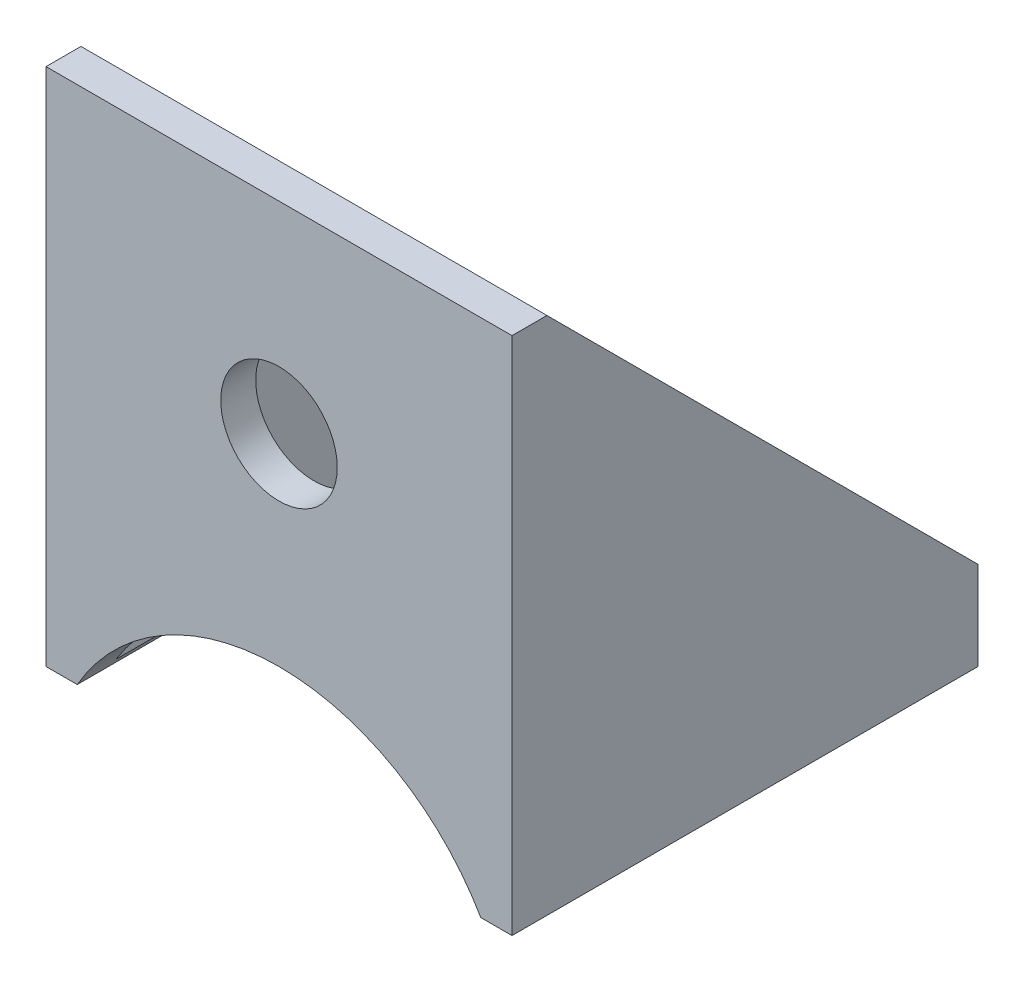
ISO-10303-21;
HEADER;
FILE_DESCRIPTION(('STEP AP214'),'2;1');
FILE_NAME('part.step','',(''),(''),'','','');
FILE_SCHEMA(('AUTOMOTIVE_DESIGN { 1 0 10303 214 1 1 1 1 }'));
ENDSEC;
DATA;
#1=APPLICATION_CONTEXT('core data for automotive mechanical design processes');
#2=APPLICATION_PROTOCOL_DEFINITION('international standard','automotive_design',2000,#1);
#3=PRODUCT_CONTEXT('',#1,'mechanical');
#4=PRODUCT('Part','Part','',(#3));
#5=PRODUCT_RELATED_PRODUCT_CATEGORY('part','',(#4));
#6=PRODUCT_DEFINITION_FORMATION('','',#4);
#7=PRODUCT_DEFINITION_CONTEXT('part definition',#1,'design');
#8=PRODUCT_DEFINITION('design','',#6,#7);
#9=PRODUCT_DEFINITION_SHAPE('','',#8);
#10=(LENGTH_UNIT() NAMED_UNIT(*) SI_UNIT(.MILLI.,.METRE.));
#11=(NAMED_UNIT(*) PLANE_ANGLE_UNIT() SI_UNIT($,.RADIAN.));
#12=(NAMED_UNIT(*) SI_UNIT($,.STERADIAN.) SOLID_ANGLE_UNIT());
#13=UNCERTAINTY_MEASURE_WITH_UNIT(LENGTH_MEASURE(1.E-05),#10,'distance_accuracy_value','');
#14=(GEOMETRIC_REPRESENTATION_CONTEXT(3) GLOBAL_UNCERTAINTY_ASSIGNED_CONTEXT((#13)) GLOBAL_UNIT_ASSIGNED_CONTEXT((#10,
#11,#12)) REPRESENTATION_CONTEXT('',''));
#15=CARTESIAN_POINT('',(0.,0.,0.));
#16=DIRECTION('',(0.,0.,1.));
#17=DIRECTION('',(1.,0.,0.));
#18=AXIS2_PLACEMENT_3D('',#15,#16,#17);
#19=CARTESIAN_POINT('',(-10.795,34.671,-12.7));
#20=DIRECTION('',(0.,0.,1.));
#21=DIRECTION('',(1.,0.,0.));
#22=AXIS2_PLACEMENT_3D('',#19,#20,#21);
#23=PLANE('',#22);
#24=DIRECTION('',(0.,-1.,0.));
#25=VECTOR('',#24,1.);
#26=CARTESIAN_POINT('',(-10.795,34.671,-12.7));
#27=LINE('',#26,#25);
#28=CARTESIAN_POINT('',(-10.795,11.1760000000002,-12.7));
#29=VERTEX_POINT('',#28);
#30=CARTESIAN_POINT('',(-10.795,6.69014013306148,-12.7));
#31=VERTEX_POINT('',#30);
#32=EDGE_CURVE('E150',#29,#31,#27,.T.);
#33=ORIENTED_EDGE('',*,*,#32,.T.);
#34=CARTESIAN_POINT('',(0.,0.,-12.7));
#35=DIRECTION('',(0.,0.,1.));
#36=DIRECTION('',(1.,0.,0.));
#37=AXIS2_PLACEMENT_3D('',#34,#35,#36);
#38=CIRCLE('',#37,12.7);
#39=CARTESIAN_POINT('',(-10.9985226280624,6.35,-12.7));
#40=VERTEX_POINT('',#39);
#41=EDGE_CURVE('E60',#31,#40,#38,.T.);
#42=ORIENTED_EDGE('',*,*,#41,.T.);
#43=DIRECTION('',(-1.,0.,0.));
#44=VECTOR('',#43,1.);
#45=CARTESIAN_POINT('',(-10.9985226280624,6.35,-12.7));
#46=LINE('',#45,#44);
#47=CARTESIAN_POINT('',(-12.7,6.35,-12.7));
#48=VERTEX_POINT('',#47);
#49=EDGE_CURVE('E138',#40,#48,#46,.T.);
#50=ORIENTED_EDGE('',*,*,#49,.T.);
#51=DIRECTION('',(0.,-1.,0.));
#52=VECTOR('',#51,1.);
#53=CARTESIAN_POINT('',(-12.7,34.671,-12.7));
#54=LINE('',#53,#52);
#55=CARTESIAN_POINT('',(-12.7,11.1760000000002,-12.7));
#56=VERTEX_POINT('',#55);
#57=EDGE_CURVE('E251',#56,#48,#54,.T.);
#58=ORIENTED_EDGE('',*,*,#57,.F.);
#59=DIRECTION('',(-1.,0.,0.));
#60=VECTOR('',#59,1.);
#61=CARTESIAN_POINT('',(12.7,11.1760000000002,-12.7));
#62=LINE('',#61,#60);
#63=EDGE_CURVE('E193',#29,#56,#62,.T.);
#64=ORIENTED_EDGE('',*,*,#63,.F.);
#65=EDGE_LOOP('',(#33,#42,#50,#58,#64));
#66=FACE_BOUND('',#65,.T.);
#67=ADVANCED_FACE('F45',(#66),#23,.F.);
#68=CARTESIAN_POINT('',(-12.7,34.671,-12.7));
#69=DIRECTION('',(1.,0.,0.));
#70=DIRECTION('',(0.,0.,-1.));
#71=AXIS2_PLACEMENT_3D('',#68,#69,#70);
#72=PLANE('',#71);
#73=ORIENTED_EDGE('',*,*,#57,.T.);
#74=DIRECTION('',(0.,0.,1.));
#75=VECTOR('',#74,1.);
#76=CARTESIAN_POINT('',(-12.7,6.35,-12.7));
#77=LINE('',#76,#75);
#78=CARTESIAN_POINT('',(-12.7,6.35,12.7));
#79=VERTEX_POINT('',#78);
#80=EDGE_CURVE('E134',#48,#79,#77,.T.);
#81=ORIENTED_EDGE('',*,*,#80,.T.);
#82=DIRECTION('',(0.,-1.,0.));
#83=VECTOR('',#82,1.);
#84=CARTESIAN_POINT('',(-12.7,34.671,12.7));
#85=LINE('',#84,#83);
#86=CARTESIAN_POINT('',(-12.7,34.671,12.7));
#87=VERTEX_POINT('',#86);
#88=EDGE_CURVE('E247',#87,#79,#85,.T.);
#89=ORIENTED_EDGE('',*,*,#88,.F.);
#90=DIRECTION('',(0.,0.,1.));
#91=VECTOR('',#90,1.);
#92=CARTESIAN_POINT('',(-12.7,34.671,-12.7));
#93=LINE('',#92,#91);
#94=CARTESIAN_POINT('',(-12.7,34.671,10.795));
#95=VERTEX_POINT('',#94);
#96=EDGE_CURVE('E211',#95,#87,#93,.T.);
#97=ORIENTED_EDGE('',*,*,#96,.F.);
#98=DIRECTION('',(0.,0.707106781186544,0.707106781186551));
#99=VECTOR('',#98,1.);
#100=CARTESIAN_POINT('',(-12.7,11.1760000000002,-12.7));
#101=LINE('',#100,#99);
#102=EDGE_CURVE('E67',#56,#95,#101,.T.);
#103=ORIENTED_EDGE('',*,*,#102,.F.);
#104=EDGE_LOOP('',(#73,#81,#89,#97,#103));
#105=FACE_BOUND('',#104,.T.);
#106=ADVANCED_FACE('F276',(#105),#72,.F.);
#107=CARTESIAN_POINT('',(-12.7,34.671,12.7));
#108=DIRECTION('',(0.,0.,-1.));
#109=DIRECTION('',(-1.,0.,0.));
#110=AXIS2_PLACEMENT_3D('',#107,#108,#109);
#111=PLANE('',#110);
#112=CARTESIAN_POINT('',(0.,23.6855,12.7));
#113=DIRECTION('',(0.,0.,1.));
#114=DIRECTION('',(1.,0.,0.));
#115=AXIS2_PLACEMENT_3D('',#112,#113,#114);
#116=CIRCLE('',#115,3.175);
#117=CARTESIAN_POINT('',(3.175,23.6855,12.7));
#118=VERTEX_POINT('',#117);
#119=EDGE_CURVE('E184',#118,#118,#116,.T.);
#120=ORIENTED_EDGE('',*,*,#119,.F.);
#121=EDGE_LOOP('',(#120));
#122=FACE_BOUND('',#121,.T.);
#123=CARTESIAN_POINT('',(0.,0.,12.7));
#124=DIRECTION('',(0.,0.,1.));
#125=DIRECTION('',(1.,0.,0.));
#126=AXIS2_PLACEMENT_3D('',#123,#124,#125);
#127=CIRCLE('',#126,12.7);
#128=CARTESIAN_POINT('',(10.9985226280624,6.35,12.7));
#129=VERTEX_POINT('',#128);
#130=CARTESIAN_POINT('',(-10.9985226280624,6.35,12.7));
#131=VERTEX_POINT('',#130);
#132=EDGE_CURVE('E130',#129,#131,#127,.T.);
#133=ORIENTED_EDGE('',*,*,#132,.F.);
#134=DIRECTION('',(-1.,0.,0.));
#135=VECTOR('',#134,1.);
#136=CARTESIAN_POINT('',(10.9985226280624,6.35,12.7));
#137=LINE('',#136,#135);
#138=CARTESIAN_POINT('',(12.7,6.35,12.7));
#139=VERTEX_POINT('',#138);
#140=EDGE_CURVE('E152',#139,#129,#137,.T.);
#141=ORIENTED_EDGE('',*,*,#140,.F.);
#142=DIRECTION('',(0.,-1.,0.));
#143=VECTOR('',#142,1.);
#144=CARTESIAN_POINT('',(12.7,34.671,12.7));
#145=LINE('',#144,#143);
#146=CARTESIAN_POINT('',(12.7,34.671,12.7));
#147=VERTEX_POINT('',#146);
#148=EDGE_CURVE('E243',#147,#139,#145,.T.);
#149=ORIENTED_EDGE('',*,*,#148,.F.);
#150=DIRECTION('',(1.,0.,0.));
#151=VECTOR('',#150,1.);
#152=CARTESIAN_POINT('',(-12.7,34.671,12.7));
#153=LINE('',#152,#151);
#154=EDGE_CURVE('E214',#87,#147,#153,.T.);
#155=ORIENTED_EDGE('',*,*,#154,.F.);
#156=ORIENTED_EDGE('',*,*,#88,.T.);
#157=DIRECTION('',(-1.,0.,0.));
#158=VECTOR('',#157,1.);
#159=CARTESIAN_POINT('',(-10.9985226280624,6.35,12.7));
#160=LINE('',#159,#158);
#161=EDGE_CURVE('E158',#131,#79,#160,.T.);
#162=ORIENTED_EDGE('',*,*,#161,.F.);
#163=EDGE_LOOP('',(#133,#141,#149,#155,#156,#162));
#164=FACE_BOUND('',#163,.T.);
#165=ADVANCED_FACE('F280',(#122,#164),#111,.F.);
#166=CARTESIAN_POINT('',(12.7,34.671,12.7));
#167=DIRECTION('',(-1.,0.,0.));
#168=DIRECTION('',(0.,0.,1.));
#169=AXIS2_PLACEMENT_3D('',#166,#167,#168);
#170=PLANE('',#169);
#171=ORIENTED_EDGE('',*,*,#148,.T.);
#172=DIRECTION('',(0.,0.,1.));
#173=VECTOR('',#172,1.);
#174=CARTESIAN_POINT('',(12.7,6.35,-12.7));
#175=LINE('',#174,#173);
#176=CARTESIAN_POINT('',(12.7,6.35,-12.7));
#177=VERTEX_POINT('',#176);
#178=EDGE_CURVE('E172',#177,#139,#175,.T.);
#179=ORIENTED_EDGE('',*,*,#178,.F.);
#180=DIRECTION('',(0.,-1.,0.));
#181=VECTOR('',#180,1.);
#182=CARTESIAN_POINT('',(12.7,34.671,-12.7));
#183=LINE('',#182,#181);
#184=CARTESIAN_POINT('',(12.7,11.1760000000002,-12.7));
#185=VERTEX_POINT('',#184);
#186=EDGE_CURVE('E239',#185,#177,#183,.T.);
#187=ORIENTED_EDGE('',*,*,#186,.F.);
#188=DIRECTION('',(0.,0.707106781186544,0.707106781186551));
#189=VECTOR('',#188,1.);
#190=CARTESIAN_POINT('',(12.7,11.1760000000002,-12.7));
#191=LINE('',#190,#189);
#192=CARTESIAN_POINT('',(12.7,34.671,10.795));
#193=VERTEX_POINT('',#192);
#194=EDGE_CURVE('E189',#185,#193,#191,.T.);
#195=ORIENTED_EDGE('',*,*,#194,.T.);
#196=DIRECTION('',(0.,0.,-1.));
#197=VECTOR('',#196,1.);
#198=CARTESIAN_POINT('',(12.7,34.671,12.7));
#199=LINE('',#198,#197);
#200=EDGE_CURVE('E217',#147,#193,#199,.T.);
#201=ORIENTED_EDGE('',*,*,#200,.F.);
#202=EDGE_LOOP('',(#171,#179,#187,#195,#201));
#203=FACE_BOUND('',#202,.T.);
#204=ADVANCED_FACE('F285',(#203),#170,.F.);
#205=CARTESIAN_POINT('',(12.7,34.671,-12.7));
#206=DIRECTION('',(0.,0.,1.));
#207=DIRECTION('',(1.,0.,0.));
#208=AXIS2_PLACEMENT_3D('',#205,#206,#207);
#209=PLANE('',#208);
#210=DIRECTION('',(-1.,0.,0.));
#211=VECTOR('',#210,1.);
#212=CARTESIAN_POINT('',(10.9985226280624,6.35,-12.7));
#213=LINE('',#212,#211);
#214=CARTESIAN_POINT('',(10.9985226280624,6.35,-12.7));
#215=VERTEX_POINT('',#214);
#216=EDGE_CURVE('E135',#177,#215,#213,.T.);
#217=ORIENTED_EDGE('',*,*,#216,.T.);
#218=CARTESIAN_POINT('',(10.795,6.69014013306149,-12.7));
#219=VERTEX_POINT('',#218);
#220=EDGE_CURVE('E145',#215,#219,#38,.T.);
#221=ORIENTED_EDGE('',*,*,#220,.T.);
#222=DIRECTION('',(0.,-1.,0.));
#223=VECTOR('',#222,1.);
#224=CARTESIAN_POINT('',(10.795,34.671,-12.7));
#225=LINE('',#224,#223);
#226=CARTESIAN_POINT('',(10.795,11.1760000000002,-12.7));
#227=VERTEX_POINT('',#226);
#228=EDGE_CURVE('E235',#227,#219,#225,.T.);
#229=ORIENTED_EDGE('',*,*,#228,.F.);
#230=EDGE_CURVE('E201',#185,#227,#62,.T.);
#231=ORIENTED_EDGE('',*,*,#230,.F.);
#232=ORIENTED_EDGE('',*,*,#186,.T.);
#233=EDGE_LOOP('',(#217,#221,#229,#231,#232));
#234=FACE_BOUND('',#233,.T.);
#235=ADVANCED_FACE('F291',(#234),#209,.F.);
#236=CARTESIAN_POINT('',(10.795,34.671,-12.7));
#237=DIRECTION('',(1.,0.,0.));
#238=DIRECTION('',(0.,0.,-1.));
#239=AXIS2_PLACEMENT_3D('',#236,#237,#238);
#240=PLANE('',#239);
#241=ORIENTED_EDGE('',*,*,#228,.T.);
#242=DIRECTION('',(0.,0.,1.));
#243=VECTOR('',#242,1.);
#244=CARTESIAN_POINT('',(10.795,6.69014013306149,-12.7));
#245=LINE('',#244,#243);
#246=CARTESIAN_POINT('',(10.795,6.69014013306148,10.795));
#247=VERTEX_POINT('',#246);
#248=EDGE_CURVE('E180',#219,#247,#245,.T.);
#249=ORIENTED_EDGE('',*,*,#248,.T.);
#250=DIRECTION('',(0.,-1.,0.));
#251=VECTOR('',#250,1.);
#252=CARTESIAN_POINT('',(10.795,34.671,10.795));
#253=LINE('',#252,#251);
#254=CARTESIAN_POINT('',(10.795,34.671,10.795));
#255=VERTEX_POINT('',#254);
#256=EDGE_CURVE('E231',#255,#247,#253,.T.);
#257=ORIENTED_EDGE('',*,*,#256,.F.);
#258=DIRECTION('',(0.,-0.707106781186544,-0.707106781186551));
#259=VECTOR('',#258,1.);
#260=CARTESIAN_POINT('',(10.795,22.9235,-0.952500000000123));
#261=LINE('',#260,#259);
#262=EDGE_CURVE('E207',#255,#227,#261,.T.);
#263=ORIENTED_EDGE('',*,*,#262,.T.);
#264=EDGE_LOOP('',(#241,#249,#257,#263));
#265=FACE_BOUND('',#264,.T.);
#266=ADVANCED_FACE('F295',(#265),#240,.F.);
#267=CARTESIAN_POINT('',(10.795,34.671,10.795));
#268=DIRECTION('',(0.,0.,1.));
#269=DIRECTION('',(1.,0.,0.));
#270=AXIS2_PLACEMENT_3D('',#267,#268,#269);
#271=PLANE('',#270);
#272=CARTESIAN_POINT('',(0.,23.6855,10.795));
#273=DIRECTION('',(0.,0.,1.));
#274=DIRECTION('',(1.,0.,0.));
#275=AXIS2_PLACEMENT_3D('',#272,#273,#274);
#276=CIRCLE('',#275,3.175);
#277=CARTESIAN_POINT('',(3.175,23.6855,10.795));
#278=VERTEX_POINT('',#277);
#279=EDGE_CURVE('E188',#278,#278,#276,.T.);
#280=ORIENTED_EDGE('',*,*,#279,.T.);
#281=EDGE_LOOP('',(#280));
#282=FACE_BOUND('',#281,.T.);
#283=ORIENTED_EDGE('',*,*,#256,.T.);
#284=CARTESIAN_POINT('',(0.,0.,10.795));
#285=DIRECTION('',(0.,0.,1.));
#286=DIRECTION('',(1.,0.,0.));
#287=AXIS2_PLACEMENT_3D('',#284,#285,#286);
#288=CIRCLE('',#287,12.7);
#289=CARTESIAN_POINT('',(-10.795,6.69014013306148,10.795));
#290=VERTEX_POINT('',#289);
#291=EDGE_CURVE('E171',#247,#290,#288,.T.);
#292=ORIENTED_EDGE('',*,*,#291,.T.);
#293=DIRECTION('',(0.,-1.,0.));
#294=VECTOR('',#293,1.);
#295=CARTESIAN_POINT('',(-10.795,34.671,10.795));
#296=LINE('',#295,#294);
#297=CARTESIAN_POINT('',(-10.795,34.671,10.795));
#298=VERTEX_POINT('',#297);
#299=EDGE_CURVE('E227',#298,#290,#296,.T.);
#300=ORIENTED_EDGE('',*,*,#299,.F.);
#301=DIRECTION('',(-1.,0.,0.));
#302=VECTOR('',#301,1.);
#303=CARTESIAN_POINT('',(10.795,34.671,10.795));
#304=LINE('',#303,#302);
#305=EDGE_CURVE('E221',#255,#298,#304,.T.);
#306=ORIENTED_EDGE('',*,*,#305,.F.);
#307=EDGE_LOOP('',(#283,#292,#300,#306));
#308=FACE_BOUND('',#307,.T.);
#309=ADVANCED_FACE('F259',(#282,#308),#271,.F.);
#310=CARTESIAN_POINT('',(-10.795,34.671,10.795));
#311=DIRECTION('',(-1.,0.,0.));
#312=DIRECTION('',(0.,0.,1.));
#313=AXIS2_PLACEMENT_3D('',#310,#311,#312);
#314=PLANE('',#313);
#315=ORIENTED_EDGE('',*,*,#299,.T.);
#316=DIRECTION('',(0.,0.,1.));
#317=VECTOR('',#316,1.);
#318=CARTESIAN_POINT('',(-10.795,6.69014013306148,-12.7));
#319=LINE('',#318,#317);
#320=EDGE_CURVE('E11',#290,#31,#319,.F.);
#321=ORIENTED_EDGE('',*,*,#320,.T.);
#322=ORIENTED_EDGE('',*,*,#32,.F.);
#323=DIRECTION('',(0.,0.707106781186544,0.707106781186551));
#324=VECTOR('',#323,1.);
#325=CARTESIAN_POINT('',(-10.795,34.671,10.795));
#326=LINE('',#325,#324);
#327=EDGE_CURVE('E200',#29,#298,#326,.T.);
#328=ORIENTED_EDGE('',*,*,#327,.T.);
#329=EDGE_LOOP('',(#315,#321,#322,#328));
#330=FACE_BOUND('',#329,.T.);
#331=ADVANCED_FACE('F302',(#330),#314,.F.);
#332=CARTESIAN_POINT('',(0.,34.671,0.));
#333=DIRECTION('',(0.,1.,0.));
#334=DIRECTION('',(0.,0.,1.));
#335=AXIS2_PLACEMENT_3D('',#332,#333,#334);
#336=PLANE('',#335);
#337=DIRECTION('',(1.,0.,0.));
#338=VECTOR('',#337,1.);
#339=CARTESIAN_POINT('',(0.,34.671,10.795));
#340=LINE('',#339,#338);
#341=EDGE_CURVE('E53',#95,#298,#340,.T.);
#342=ORIENTED_EDGE('',*,*,#341,.F.);
#343=ORIENTED_EDGE('',*,*,#96,.T.);
#344=ORIENTED_EDGE('',*,*,#154,.T.);
#345=ORIENTED_EDGE('',*,*,#200,.T.);
#346=DIRECTION('',(-1.,0.,0.));
#347=VECTOR('',#346,1.);
#348=CARTESIAN_POINT('',(12.7,34.671,10.795));
#349=LINE('',#348,#347);
#350=EDGE_CURVE('E196',#193,#255,#349,.T.);
#351=ORIENTED_EDGE('',*,*,#350,.T.);
#352=ORIENTED_EDGE('',*,*,#305,.T.);
#353=EDGE_LOOP('',(#342,#343,#344,#345,#351,#352));
#354=FACE_BOUND('',#353,.T.);
#355=ADVANCED_FACE('F305',(#354),#336,.T.);
#356=CARTESIAN_POINT('',(12.7,11.1760000000002,-12.7));
#357=DIRECTION('',(0.,-0.707106781186551,0.707106781186544));
#358=DIRECTION('',(0.,-0.707106781186544,-0.707106781186551));
#359=AXIS2_PLACEMENT_3D('',#356,#357,#358);
#360=PLANE('',#359);
#361=ORIENTED_EDGE('',*,*,#350,.F.);
#362=ORIENTED_EDGE('',*,*,#194,.F.);
#363=ORIENTED_EDGE('',*,*,#230,.T.);
#364=ORIENTED_EDGE('',*,*,#262,.F.);
#365=EDGE_LOOP('',(#361,#362,#363,#364));
#366=FACE_BOUND('',#365,.T.);
#367=ADVANCED_FACE('F274',(#366),#360,.F.);
#368=ORIENTED_EDGE('',*,*,#63,.T.);
#369=ORIENTED_EDGE('',*,*,#102,.T.);
#370=ORIENTED_EDGE('',*,*,#341,.T.);
#371=ORIENTED_EDGE('',*,*,#327,.F.);
#372=EDGE_LOOP('',(#368,#369,#370,#371));
#373=FACE_BOUND('',#372,.T.);
#374=ADVANCED_FACE('F264',(#373),#360,.F.);
#375=CARTESIAN_POINT('',(0.,23.6855,-12.7));
#376=DIRECTION('',(0.,0.,1.));
#377=DIRECTION('',(1.,0.,0.));
#378=AXIS2_PLACEMENT_3D('',#375,#376,#377);
#379=CYLINDRICAL_SURFACE('',#378,3.175);
#380=CARTESIAN_POINT('',(3.175,23.6855,12.7));
#381=CARTESIAN_POINT('',(3.175,23.6855,12.68015625));
#382=CARTESIAN_POINT('',(3.175,23.6855,12.6603125));
#383=CARTESIAN_POINT('',(3.175,23.6855,12.620625));
#384=CARTESIAN_POINT('',(3.175,23.6855,12.60078125));
#385=CARTESIAN_POINT('',(3.175,23.6855,12.56109375));
#386=CARTESIAN_POINT('',(3.175,23.6855,12.54125));
#387=CARTESIAN_POINT('',(3.175,23.6855,12.5015625));
#388=CARTESIAN_POINT('',(3.175,23.6855,12.48171875));
#389=CARTESIAN_POINT('',(3.175,23.6855,12.44203125));
#390=CARTESIAN_POINT('',(3.175,23.6855,12.4221875));
#391=CARTESIAN_POINT('',(3.175,23.6855,12.3825));
#392=CARTESIAN_POINT('',(3.175,23.6855,12.36265625));
#393=CARTESIAN_POINT('',(3.175,23.6855,12.32296875));
#394=CARTESIAN_POINT('',(3.175,23.6855,12.303125));
#395=CARTESIAN_POINT('',(3.175,23.6855,12.2634375));
#396=CARTESIAN_POINT('',(3.175,23.6855,12.24359375));
#397=CARTESIAN_POINT('',(3.175,23.6855,12.20390625));
#398=CARTESIAN_POINT('',(3.175,23.6855,12.1840625));
#399=CARTESIAN_POINT('',(3.175,23.6855,12.144375));
#400=CARTESIAN_POINT('',(3.175,23.6855,12.12453125));
#401=CARTESIAN_POINT('',(3.175,23.6855,12.08484375));
#402=CARTESIAN_POINT('',(3.175,23.6855,12.065));
#403=CARTESIAN_POINT('',(3.175,23.6855,12.0253125));
#404=CARTESIAN_POINT('',(3.175,23.6855,12.00546875));
#405=CARTESIAN_POINT('',(3.175,23.6855,11.96578125));
#406=CARTESIAN_POINT('',(3.175,23.6855,11.9459375));
#407=CARTESIAN_POINT('',(3.175,23.6855,11.90625));
#408=CARTESIAN_POINT('',(3.175,23.6855,11.88640625));
#409=CARTESIAN_POINT('',(3.175,23.6855,11.84671875));
#410=CARTESIAN_POINT('',(3.175,23.6855,11.826875));
#411=CARTESIAN_POINT('',(3.175,23.6855,11.7871875));
#412=CARTESIAN_POINT('',(3.175,23.6855,11.76734375));
#413=CARTESIAN_POINT('',(3.175,23.6855,11.72765625));
#414=CARTESIAN_POINT('',(3.175,23.6855,11.7078125));
#415=CARTESIAN_POINT('',(3.175,23.6855,11.668125));
#416=CARTESIAN_POINT('',(3.175,23.6855,11.64828125));
#417=CARTESIAN_POINT('',(3.175,23.6855,11.60859375));
#418=CARTESIAN_POINT('',(3.175,23.6855,11.58875));
#419=CARTESIAN_POINT('',(3.175,23.6855,11.5490625));
#420=CARTESIAN_POINT('',(3.175,23.6855,11.52921875));
#421=CARTESIAN_POINT('',(3.175,23.6855,11.48953125));
#422=CARTESIAN_POINT('',(3.175,23.6855,11.4696875));
#423=CARTESIAN_POINT('',(3.175,23.6855,11.43));
#424=CARTESIAN_POINT('',(3.175,23.6855,11.41015625));
#425=CARTESIAN_POINT('',(3.175,23.6855,11.37046875));
#426=CARTESIAN_POINT('',(3.175,23.6855,11.350625));
#427=CARTESIAN_POINT('',(3.175,23.6855,11.3109375));
#428=CARTESIAN_POINT('',(3.175,23.6855,11.29109375));
#429=CARTESIAN_POINT('',(3.175,23.6855,11.25140625));
#430=CARTESIAN_POINT('',(3.175,23.6855,11.2315625));
#431=CARTESIAN_POINT('',(3.175,23.6855,11.191875));
#432=CARTESIAN_POINT('',(3.175,23.6855,11.17203125));
#433=CARTESIAN_POINT('',(3.175,23.6855,11.13234375));
#434=CARTESIAN_POINT('',(3.175,23.6855,11.1125));
#435=CARTESIAN_POINT('',(3.175,23.6855,11.0728125));
#436=CARTESIAN_POINT('',(3.175,23.6855,11.05296875));
#437=CARTESIAN_POINT('',(3.175,23.6855,11.01328125));
#438=CARTESIAN_POINT('',(3.175,23.6855,10.9934375));
#439=CARTESIAN_POINT('',(3.175,23.6855,10.95375));
#440=CARTESIAN_POINT('',(3.175,23.6855,10.93390625));
#441=CARTESIAN_POINT('',(3.175,23.6855,10.89421875));
#442=CARTESIAN_POINT('',(3.175,23.6855,10.874375));
#443=CARTESIAN_POINT('',(3.175,23.6855,10.8346875));
#444=CARTESIAN_POINT('',(3.175,23.6855,10.81484375));
#445=CARTESIAN_POINT('',(3.175,23.6855,10.795));
#446=B_SPLINE_CURVE_WITH_KNOTS('',3,(#380,#381,#382,#383,#384,#385,#386,#387,#388,#389,#390,
#391,#392,#393,#394,#395,#396,#397,#398,#399,#400,#401,#402,#403,#404,#405,#406,#407,#408,#409,
#410,#411,#412,#413,#414,#415,#416,#417,#418,#419,#420,#421,#422,#423,#424,#425,#426,#427,#428,
#429,#430,#431,#432,#433,#434,#435,#436,#437,#438,#439,#440,#441,#442,#443,#444,#445),
.UNSPECIFIED.,.F.,.F.,(4,2,2,2,2,2,2,2,2,2,2,2,2,2,2,2,2,2,2,2,2,2,2,2,2,2,2,2,2,2,2,2,4),(0.,
0.0595312500000014,0.119062499999999,0.178593750000001,0.238124999999999,0.29765625,
0.357187499999998,0.41671875,0.476249999999998,0.535781249999999,0.5953125,0.654843749999998,
0.714375,0.773906249999998,0.833437499999999,0.892968749999997,0.952499999999998,1.01203125,
1.0715625,1.13109375,1.190625,1.25015625,1.3096875,1.36921875,1.42875,1.48828125,1.5478125,
1.60734375,1.666875,1.72640625,1.7859375,1.84546875,1.905),.UNSPECIFIED.);
#447=EDGE_CURVE('BSEAM262',#118,#278,#446,.T.);
#448=ORIENTED_EDGE('',*,*,#119,.T.);
#449=ORIENTED_EDGE('',*,*,#279,.F.);
#450=ORIENTED_EDGE('',*,*,#447,.T.);
#451=ORIENTED_EDGE('',*,*,#447,.F.);
#452=EDGE_LOOP('',(#448,#450,#449,#451));
#453=FACE_BOUND('',#452,.T.);
#454=ADVANCED_FACE('F262',(#453),#379,.F.);
#455=CARTESIAN_POINT('',(0.,0.,-12.7));
#456=DIRECTION('',(0.,0.,1.));
#457=DIRECTION('',(1.,0.,0.));
#458=AXIS2_PLACEMENT_3D('',#455,#456,#457);
#459=CYLINDRICAL_SURFACE('',#458,12.7);
#460=ORIENTED_EDGE('',*,*,#220,.F.);
#461=DIRECTION('',(0.,0.,1.));
#462=VECTOR('',#461,1.);
#463=CARTESIAN_POINT('',(10.9985226280624,6.35,-12.7));
#464=LINE('',#463,#462);
#465=EDGE_CURVE('E168',#215,#129,#464,.T.);
#466=ORIENTED_EDGE('',*,*,#465,.T.);
#467=ORIENTED_EDGE('',*,*,#132,.T.);
#468=DIRECTION('',(0.,0.,1.));
#469=VECTOR('',#468,1.);
#470=CARTESIAN_POINT('',(-10.9985226280624,6.35,-12.7));
#471=LINE('',#470,#469);
#472=EDGE_CURVE('E125',#40,#131,#471,.T.);
#473=ORIENTED_EDGE('',*,*,#472,.F.);
#474=ORIENTED_EDGE('',*,*,#41,.F.);
#475=ORIENTED_EDGE('',*,*,#320,.F.);
#476=ORIENTED_EDGE('',*,*,#291,.F.);
#477=ORIENTED_EDGE('',*,*,#248,.F.);
#478=EDGE_LOOP('',(#460,#466,#467,#473,#474,#475,#476,#477));
#479=FACE_BOUND('',#478,.T.);
#480=ADVANCED_FACE('F128',(#479),#459,.F.);
#481=CARTESIAN_POINT('',(10.9985226280624,6.35,-12.7));
#482=DIRECTION('',(0.,1.,0.));
#483=DIRECTION('',(-1.,0.,0.));
#484=AXIS2_PLACEMENT_3D('',#481,#482,#483);
#485=PLANE('',#484);
#486=ORIENTED_EDGE('',*,*,#140,.T.);
#487=ORIENTED_EDGE('',*,*,#465,.F.);
#488=ORIENTED_EDGE('',*,*,#216,.F.);
#489=ORIENTED_EDGE('',*,*,#178,.T.);
#490=EDGE_LOOP('',(#486,#487,#488,#489));
#491=FACE_BOUND('',#490,.T.);
#492=ADVANCED_FACE('F272',(#491),#485,.F.);
#493=CARTESIAN_POINT('',(-10.9985226280624,6.35,-12.7));
#494=DIRECTION('',(0.,1.,0.));
#495=DIRECTION('',(-1.,0.,0.));
#496=AXIS2_PLACEMENT_3D('',#493,#494,#495);
#497=PLANE('',#496);
#498=ORIENTED_EDGE('',*,*,#161,.T.);
#499=ORIENTED_EDGE('',*,*,#80,.F.);
#500=ORIENTED_EDGE('',*,*,#49,.F.);
#501=ORIENTED_EDGE('',*,*,#472,.T.);
#502=EDGE_LOOP('',(#498,#499,#500,#501));
#503=FACE_BOUND('',#502,.T.);
#504=ADVANCED_FACE('F139',(#503),#497,.F.);
#505=CLOSED_SHELL('',(#67,#106,#165,#204,#235,#266,#309,#331,#355,#367,#374,#454,#480,#492,#504));
#506=MANIFOLD_SOLID_BREP('B2',#505);
#507=ADVANCED_BREP_SHAPE_REPRESENTATION('',(#18,#506),#14);
#508=SHAPE_DEFINITION_REPRESENTATION(#9,#507);
ENDSEC;
END-ISO-10303-21;
